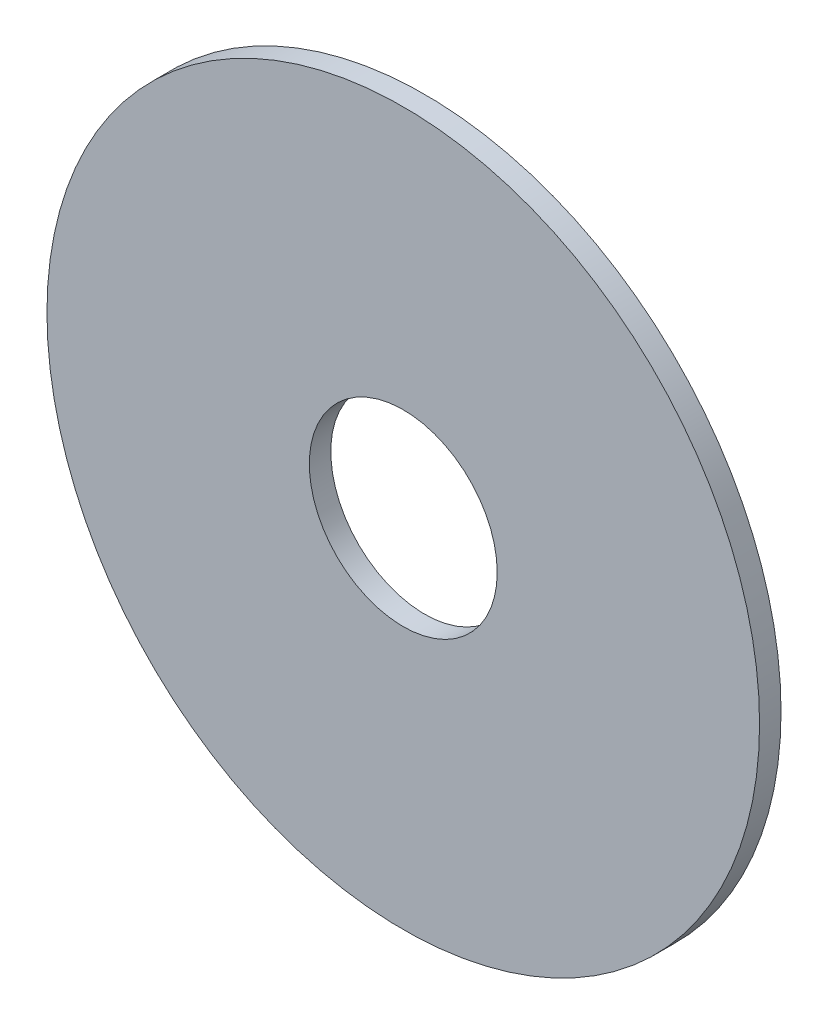
ISO-10303-21;
HEADER;
FILE_DESCRIPTION(('STEP AP214'),'2;1');
FILE_NAME('part.step','',(''),(''),'','','');
FILE_SCHEMA(('AUTOMOTIVE_DESIGN { 1 0 10303 214 1 1 1 1 }'));
ENDSEC;
DATA;
#1=APPLICATION_CONTEXT('core data for automotive mechanical design processes');
#2=APPLICATION_PROTOCOL_DEFINITION('international standard','automotive_design',2000,#1);
#3=PRODUCT_CONTEXT('',#1,'mechanical');
#4=PRODUCT('Part','Part','',(#3));
#5=PRODUCT_RELATED_PRODUCT_CATEGORY('part','',(#4));
#6=PRODUCT_DEFINITION_FORMATION('','',#4);
#7=PRODUCT_DEFINITION_CONTEXT('part definition',#1,'design');
#8=PRODUCT_DEFINITION('design','',#6,#7);
#9=PRODUCT_DEFINITION_SHAPE('','',#8);
#10=(LENGTH_UNIT() NAMED_UNIT(*) SI_UNIT(.MILLI.,.METRE.));
#11=(NAMED_UNIT(*) PLANE_ANGLE_UNIT() SI_UNIT($,.RADIAN.));
#12=(NAMED_UNIT(*) SI_UNIT($,.STERADIAN.) SOLID_ANGLE_UNIT());
#13=UNCERTAINTY_MEASURE_WITH_UNIT(LENGTH_MEASURE(1.E-05),#10,'distance_accuracy_value','');
#14=(GEOMETRIC_REPRESENTATION_CONTEXT(3) GLOBAL_UNCERTAINTY_ASSIGNED_CONTEXT((#13)) GLOBAL_UNIT_ASSIGNED_CONTEXT((#10,
#11,#12)) REPRESENTATION_CONTEXT('',''));
#15=CARTESIAN_POINT('',(0.,0.,0.));
#16=DIRECTION('',(0.,0.,1.));
#17=DIRECTION('',(1.,0.,0.));
#18=AXIS2_PLACEMENT_3D('',#15,#16,#17);
#19=CARTESIAN_POINT('',(4.25452960799852,4.59684753650198,4.));
#20=DIRECTION('',(0.,0.,1.));
#21=DIRECTION('',(1.,0.,0.));
#22=AXIS2_PLACEMENT_3D('',#19,#20,#21);
#23=PLANE('',#22);
#24=CARTESIAN_POINT('',(4.25452960799852,4.59684753650198,4.));
#25=DIRECTION('',(0.,0.,1.));
#26=DIRECTION('',(1.,0.,0.));
#27=AXIS2_PLACEMENT_3D('',#24,#25,#26);
#28=CIRCLE('',#27,66.3699999999986);
#29=CARTESIAN_POINT('',(70.6245296079971,4.59684753650198,4.));
#30=VERTEX_POINT('',#29);
#31=EDGE_CURVE('E10',#30,#30,#28,.T.);
#32=ORIENTED_EDGE('',*,*,#31,.T.);
#33=EDGE_LOOP('',(#32));
#34=FACE_BOUND('',#33,.T.);
#35=CARTESIAN_POINT('',(4.25452960799852,4.59684753650198,4.));
#36=DIRECTION('',(0.,0.,1.));
#37=DIRECTION('',(1.,0.,0.));
#38=AXIS2_PLACEMENT_3D('',#35,#36,#37);
#39=CIRCLE('',#38,17.5);
#40=CARTESIAN_POINT('',(21.7545296079985,4.59684753650198,4.));
#41=VERTEX_POINT('',#40);
#42=EDGE_CURVE('E41',#41,#41,#39,.T.);
#43=ORIENTED_EDGE('',*,*,#42,.F.);
#44=EDGE_LOOP('',(#43));
#45=FACE_BOUND('',#44,.T.);
#46=ADVANCED_FACE('F30',(#34,#45),#23,.T.);
#47=CARTESIAN_POINT('',(4.25452960799852,4.59684753650198,0.));
#48=DIRECTION('',(0.,0.,1.));
#49=DIRECTION('',(1.,0.,0.));
#50=AXIS2_PLACEMENT_3D('',#47,#48,#49);
#51=PLANE('',#50);
#52=CARTESIAN_POINT('',(4.25452960799852,4.59684753650198,0.));
#53=DIRECTION('',(0.,0.,1.));
#54=DIRECTION('',(1.,0.,0.));
#55=AXIS2_PLACEMENT_3D('',#52,#53,#54);
#56=CIRCLE('',#55,66.3699999999986);
#57=CARTESIAN_POINT('',(70.6245296079971,4.59684753650198,0.));
#58=VERTEX_POINT('',#57);
#59=EDGE_CURVE('E34',#58,#58,#56,.T.);
#60=ORIENTED_EDGE('',*,*,#59,.F.);
#61=EDGE_LOOP('',(#60));
#62=FACE_BOUND('',#61,.T.);
#63=CARTESIAN_POINT('',(4.25452960799852,4.59684753650198,0.));
#64=DIRECTION('',(0.,0.,1.));
#65=DIRECTION('',(1.,0.,0.));
#66=AXIS2_PLACEMENT_3D('',#63,#64,#65);
#67=CIRCLE('',#66,17.5);
#68=CARTESIAN_POINT('',(21.7545296079985,4.59684753650198,0.));
#69=VERTEX_POINT('',#68);
#70=EDGE_CURVE('E43',#69,#69,#67,.T.);
#71=ORIENTED_EDGE('',*,*,#70,.T.);
#72=EDGE_LOOP('',(#71));
#73=FACE_BOUND('',#72,.T.);
#74=ADVANCED_FACE('F53',(#62,#73),#51,.F.);
#75=CARTESIAN_POINT('',(4.25452960799852,4.59684753650198,4.));
#76=DIRECTION('',(0.,0.,-1.));
#77=DIRECTION('',(-1.,0.,0.));
#78=AXIS2_PLACEMENT_3D('',#75,#76,#77);
#79=CYLINDRICAL_SURFACE('',#78,66.3699999999986);
#80=ORIENTED_EDGE('',*,*,#31,.F.);
#81=EDGE_LOOP('',(#80));
#82=FACE_BOUND('',#81,.T.);
#83=ORIENTED_EDGE('',*,*,#59,.T.);
#84=EDGE_LOOP('',(#83));
#85=FACE_BOUND('',#84,.T.);
#86=ADVANCED_FACE('F32',(#82,#85),#79,.T.);
#87=CARTESIAN_POINT('',(4.25452960799852,4.59684753650198,4.));
#88=DIRECTION('',(0.,0.,-1.));
#89=DIRECTION('',(-1.,0.,0.));
#90=AXIS2_PLACEMENT_3D('',#87,#88,#89);
#91=CYLINDRICAL_SURFACE('',#90,17.5);
#92=ORIENTED_EDGE('',*,*,#42,.T.);
#93=EDGE_LOOP('',(#92));
#94=FACE_BOUND('',#93,.T.);
#95=ORIENTED_EDGE('',*,*,#70,.F.);
#96=EDGE_LOOP('',(#95));
#97=FACE_BOUND('',#96,.T.);
#98=ADVANCED_FACE('F49',(#94,#97),#91,.F.);
#99=CLOSED_SHELL('',(#46,#74,#86,#98));
#100=MANIFOLD_SOLID_BREP('B2',#99);
#101=ADVANCED_BREP_SHAPE_REPRESENTATION('',(#18,#100),#14);
#102=SHAPE_DEFINITION_REPRESENTATION(#9,#101);
ENDSEC;
END-ISO-10303-21;
